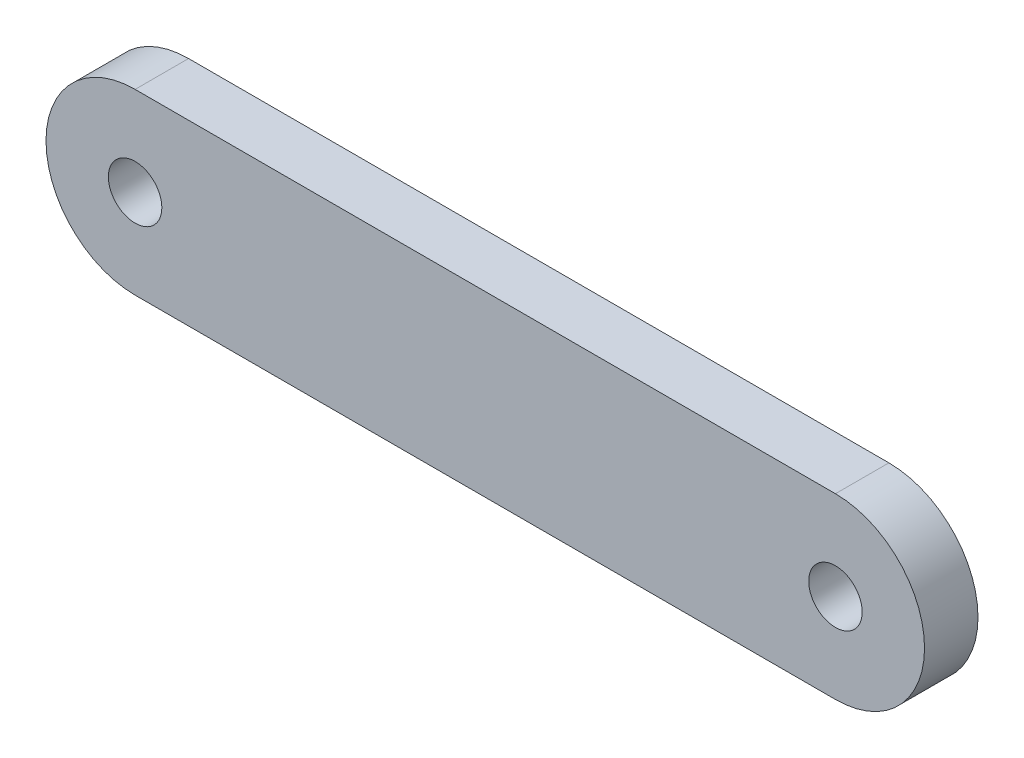
ISO-10303-21;
HEADER;
FILE_DESCRIPTION(('STEP AP214'),'2;1');
FILE_NAME('part.step','',(''),(''),'','','');
FILE_SCHEMA(('AUTOMOTIVE_DESIGN { 1 0 10303 214 1 1 1 1 }'));
ENDSEC;
DATA;
#1=APPLICATION_CONTEXT('core data for automotive mechanical design processes');
#2=APPLICATION_PROTOCOL_DEFINITION('international standard','automotive_design',2000,#1);
#3=PRODUCT_CONTEXT('',#1,'mechanical');
#4=PRODUCT('Part','Part','',(#3));
#5=PRODUCT_RELATED_PRODUCT_CATEGORY('part','',(#4));
#6=PRODUCT_DEFINITION_FORMATION('','',#4);
#7=PRODUCT_DEFINITION_CONTEXT('part definition',#1,'design');
#8=PRODUCT_DEFINITION('design','',#6,#7);
#9=PRODUCT_DEFINITION_SHAPE('','',#8);
#10=(LENGTH_UNIT() NAMED_UNIT(*) SI_UNIT(.MILLI.,.METRE.));
#11=(NAMED_UNIT(*) PLANE_ANGLE_UNIT() SI_UNIT($,.RADIAN.));
#12=(NAMED_UNIT(*) SI_UNIT($,.STERADIAN.) SOLID_ANGLE_UNIT());
#13=UNCERTAINTY_MEASURE_WITH_UNIT(LENGTH_MEASURE(1.E-05),#10,'distance_accuracy_value','');
#14=(GEOMETRIC_REPRESENTATION_CONTEXT(3) GLOBAL_UNCERTAINTY_ASSIGNED_CONTEXT((#13)) GLOBAL_UNIT_ASSIGNED_CONTEXT((#10,
#11,#12)) REPRESENTATION_CONTEXT('',''));
#15=CARTESIAN_POINT('',(0.,0.,0.));
#16=DIRECTION('',(0.,0.,1.));
#17=DIRECTION('',(1.,0.,0.));
#18=AXIS2_PLACEMENT_3D('',#15,#16,#17);
#19=CARTESIAN_POINT('',(0.,0.,3.));
#20=DIRECTION('',(0.,0.,1.));
#21=DIRECTION('',(1.,0.,0.));
#22=AXIS2_PLACEMENT_3D('',#19,#20,#21);
#23=PLANE('',#22);
#24=CARTESIAN_POINT('',(0.,0.,3.));
#25=DIRECTION('',(0.,0.,1.));
#26=DIRECTION('',(1.,0.,0.));
#27=AXIS2_PLACEMENT_3D('',#24,#25,#26);
#28=CIRCLE('',#27,1.5);
#29=CARTESIAN_POINT('',(1.5,0.,3.));
#30=VERTEX_POINT('',#29);
#31=EDGE_CURVE('E104',#30,#30,#28,.T.);
#32=ORIENTED_EDGE('',*,*,#31,.F.);
#33=EDGE_LOOP('',(#32));
#34=FACE_BOUND('',#33,.T.);
#35=CARTESIAN_POINT('',(0.,0.,3.));
#36=DIRECTION('',(0.,0.,1.));
#37=DIRECTION('',(1.,0.,0.));
#38=AXIS2_PLACEMENT_3D('',#35,#36,#37);
#39=CIRCLE('',#38,5.);
#40=CARTESIAN_POINT('',(0.,5.,3.));
#41=VERTEX_POINT('',#40);
#42=CARTESIAN_POINT('',(0.,-5.,3.));
#43=VERTEX_POINT('',#42);
#44=EDGE_CURVE('E89',#41,#43,#39,.T.);
#45=ORIENTED_EDGE('',*,*,#44,.T.);
#46=DIRECTION('',(1.,0.,0.));
#47=VECTOR('',#46,1.);
#48=CARTESIAN_POINT('',(0.,-5.,3.));
#49=LINE('',#48,#47);
#50=CARTESIAN_POINT('',(39.3,-5.,3.));
#51=VERTEX_POINT('',#50);
#52=EDGE_CURVE('E84',#43,#51,#49,.T.);
#53=ORIENTED_EDGE('',*,*,#52,.T.);
#54=CARTESIAN_POINT('',(39.3,0.,3.));
#55=DIRECTION('',(0.,0.,1.));
#56=DIRECTION('',(1.,0.,0.));
#57=AXIS2_PLACEMENT_3D('',#54,#55,#56);
#58=CIRCLE('',#57,5.);
#59=CARTESIAN_POINT('',(39.3,5.,3.));
#60=VERTEX_POINT('',#59);
#61=EDGE_CURVE('E87',#51,#60,#58,.T.);
#62=ORIENTED_EDGE('',*,*,#61,.T.);
#63=DIRECTION('',(-1.,0.,0.));
#64=VECTOR('',#63,1.);
#65=CARTESIAN_POINT('',(0.,5.,3.));
#66=LINE('',#65,#64);
#67=EDGE_CURVE('E54',#60,#41,#66,.T.);
#68=ORIENTED_EDGE('',*,*,#67,.T.);
#69=EDGE_LOOP('',(#45,#53,#62,#68));
#70=FACE_BOUND('',#69,.T.);
#71=CARTESIAN_POINT('',(39.3,0.,3.));
#72=DIRECTION('',(0.,0.,1.));
#73=DIRECTION('',(1.,0.,0.));
#74=AXIS2_PLACEMENT_3D('',#71,#72,#73);
#75=CIRCLE('',#74,1.5);
#76=CARTESIAN_POINT('',(40.8,0.,3.));
#77=VERTEX_POINT('',#76);
#78=EDGE_CURVE('E119',#77,#77,#75,.T.);
#79=ORIENTED_EDGE('',*,*,#78,.F.);
#80=EDGE_LOOP('',(#79));
#81=FACE_BOUND('',#80,.T.);
#82=ADVANCED_FACE('F37',(#34,#70,#81),#23,.T.);
#83=CARTESIAN_POINT('',(0.,0.,0.));
#84=DIRECTION('',(0.,0.,1.));
#85=DIRECTION('',(1.,0.,0.));
#86=AXIS2_PLACEMENT_3D('',#83,#84,#85);
#87=PLANE('',#86);
#88=CARTESIAN_POINT('',(0.,0.,0.));
#89=DIRECTION('',(0.,0.,1.));
#90=DIRECTION('',(1.,0.,0.));
#91=AXIS2_PLACEMENT_3D('',#88,#89,#90);
#92=CIRCLE('',#91,5.);
#93=CARTESIAN_POINT('',(0.,5.,0.));
#94=VERTEX_POINT('',#93);
#95=CARTESIAN_POINT('',(0.,-5.,0.));
#96=VERTEX_POINT('',#95);
#97=EDGE_CURVE('E101',#94,#96,#92,.T.);
#98=ORIENTED_EDGE('',*,*,#97,.F.);
#99=DIRECTION('',(-1.,0.,0.));
#100=VECTOR('',#99,1.);
#101=CARTESIAN_POINT('',(0.,5.,0.));
#102=LINE('',#101,#100);
#103=CARTESIAN_POINT('',(39.3,5.,0.));
#104=VERTEX_POINT('',#103);
#105=EDGE_CURVE('E77',#104,#94,#102,.T.);
#106=ORIENTED_EDGE('',*,*,#105,.F.);
#107=CARTESIAN_POINT('',(39.3,0.,0.));
#108=DIRECTION('',(0.,0.,1.));
#109=DIRECTION('',(1.,0.,0.));
#110=AXIS2_PLACEMENT_3D('',#107,#108,#109);
#111=CIRCLE('',#110,5.);
#112=CARTESIAN_POINT('',(39.3,-5.,0.));
#113=VERTEX_POINT('',#112);
#114=EDGE_CURVE('E71',#113,#104,#111,.T.);
#115=ORIENTED_EDGE('',*,*,#114,.F.);
#116=DIRECTION('',(1.,0.,0.));
#117=VECTOR('',#116,1.);
#118=CARTESIAN_POINT('',(0.,-5.,0.));
#119=LINE('',#118,#117);
#120=EDGE_CURVE('E93',#96,#113,#119,.T.);
#121=ORIENTED_EDGE('',*,*,#120,.F.);
#122=EDGE_LOOP('',(#98,#106,#115,#121));
#123=FACE_BOUND('',#122,.T.);
#124=CARTESIAN_POINT('',(0.,0.,0.));
#125=DIRECTION('',(0.,0.,1.));
#126=DIRECTION('',(1.,0.,0.));
#127=AXIS2_PLACEMENT_3D('',#124,#125,#126);
#128=CIRCLE('',#127,1.5);
#129=CARTESIAN_POINT('',(1.5,0.,0.));
#130=VERTEX_POINT('',#129);
#131=EDGE_CURVE('E116',#130,#130,#128,.T.);
#132=ORIENTED_EDGE('',*,*,#131,.T.);
#133=EDGE_LOOP('',(#132));
#134=FACE_BOUND('',#133,.T.);
#135=CARTESIAN_POINT('',(39.3,0.,0.));
#136=DIRECTION('',(0.,0.,1.));
#137=DIRECTION('',(1.,0.,0.));
#138=AXIS2_PLACEMENT_3D('',#135,#136,#137);
#139=CIRCLE('',#138,1.5);
#140=CARTESIAN_POINT('',(40.8,0.,0.));
#141=VERTEX_POINT('',#140);
#142=EDGE_CURVE('E122',#141,#141,#139,.T.);
#143=ORIENTED_EDGE('',*,*,#142,.T.);
#144=EDGE_LOOP('',(#143));
#145=FACE_BOUND('',#144,.T.);
#146=ADVANCED_FACE('F112',(#123,#134,#145),#87,.F.);
#147=CARTESIAN_POINT('',(0.,0.,3.));
#148=DIRECTION('',(0.,0.,-1.));
#149=DIRECTION('',(-1.,0.,0.));
#150=AXIS2_PLACEMENT_3D('',#147,#148,#149);
#151=CYLINDRICAL_SURFACE('',#150,5.);
#152=ORIENTED_EDGE('',*,*,#97,.T.);
#153=DIRECTION('',(0.,0.,-1.));
#154=VECTOR('',#153,1.);
#155=CARTESIAN_POINT('',(0.,-5.,3.));
#156=LINE('',#155,#154);
#157=EDGE_CURVE('E11',#43,#96,#156,.T.);
#158=ORIENTED_EDGE('',*,*,#157,.F.);
#159=ORIENTED_EDGE('',*,*,#44,.F.);
#160=DIRECTION('',(0.,0.,-1.));
#161=VECTOR('',#160,1.);
#162=CARTESIAN_POINT('',(0.,5.,3.));
#163=LINE('',#162,#161);
#164=EDGE_CURVE('E97',#41,#94,#163,.T.);
#165=ORIENTED_EDGE('',*,*,#164,.T.);
#166=EDGE_LOOP('',(#152,#158,#159,#165));
#167=FACE_BOUND('',#166,.T.);
#168=ADVANCED_FACE('F39',(#167),#151,.T.);
#169=CARTESIAN_POINT('',(0.,-5.,3.));
#170=DIRECTION('',(0.,1.,0.));
#171=DIRECTION('',(0.,0.,1.));
#172=AXIS2_PLACEMENT_3D('',#169,#170,#171);
#173=PLANE('',#172);
#174=ORIENTED_EDGE('',*,*,#120,.T.);
#175=DIRECTION('',(0.,0.,-1.));
#176=VECTOR('',#175,1.);
#177=CARTESIAN_POINT('',(39.3,-5.,3.));
#178=LINE('',#177,#176);
#179=EDGE_CURVE('E46',#51,#113,#178,.T.);
#180=ORIENTED_EDGE('',*,*,#179,.F.);
#181=ORIENTED_EDGE('',*,*,#52,.F.);
#182=ORIENTED_EDGE('',*,*,#157,.T.);
#183=EDGE_LOOP('',(#174,#180,#181,#182));
#184=FACE_BOUND('',#183,.T.);
#185=ADVANCED_FACE('F92',(#184),#173,.F.);
#186=CARTESIAN_POINT('',(39.3,0.,3.));
#187=DIRECTION('',(0.,0.,-1.));
#188=DIRECTION('',(-1.,0.,0.));
#189=AXIS2_PLACEMENT_3D('',#186,#187,#188);
#190=CYLINDRICAL_SURFACE('',#189,5.);
#191=ORIENTED_EDGE('',*,*,#114,.T.);
#192=DIRECTION('',(0.,0.,-1.));
#193=VECTOR('',#192,1.);
#194=CARTESIAN_POINT('',(39.3,5.,3.));
#195=LINE('',#194,#193);
#196=EDGE_CURVE('E94',#60,#104,#195,.T.);
#197=ORIENTED_EDGE('',*,*,#196,.F.);
#198=ORIENTED_EDGE('',*,*,#61,.F.);
#199=ORIENTED_EDGE('',*,*,#179,.T.);
#200=EDGE_LOOP('',(#191,#197,#198,#199));
#201=FACE_BOUND('',#200,.T.);
#202=ADVANCED_FACE('F95',(#201),#190,.T.);
#203=CARTESIAN_POINT('',(0.,5.,3.));
#204=DIRECTION('',(0.,-1.,0.));
#205=DIRECTION('',(0.,0.,-1.));
#206=AXIS2_PLACEMENT_3D('',#203,#204,#205);
#207=PLANE('',#206);
#208=ORIENTED_EDGE('',*,*,#105,.T.);
#209=ORIENTED_EDGE('',*,*,#164,.F.);
#210=ORIENTED_EDGE('',*,*,#67,.F.);
#211=ORIENTED_EDGE('',*,*,#196,.T.);
#212=EDGE_LOOP('',(#208,#209,#210,#211));
#213=FACE_BOUND('',#212,.T.);
#214=ADVANCED_FACE('F109',(#213),#207,.F.);
#215=CARTESIAN_POINT('',(0.,0.,3.));
#216=DIRECTION('',(0.,0.,-1.));
#217=DIRECTION('',(-1.,0.,0.));
#218=AXIS2_PLACEMENT_3D('',#215,#216,#217);
#219=CYLINDRICAL_SURFACE('',#218,1.5);
#220=ORIENTED_EDGE('',*,*,#31,.T.);
#221=EDGE_LOOP('',(#220));
#222=FACE_BOUND('',#221,.T.);
#223=ORIENTED_EDGE('',*,*,#131,.F.);
#224=EDGE_LOOP('',(#223));
#225=FACE_BOUND('',#224,.T.);
#226=ADVANCED_FACE('F139',(#222,#225),#219,.F.);
#227=CARTESIAN_POINT('',(39.3,0.,3.));
#228=DIRECTION('',(0.,0.,-1.));
#229=DIRECTION('',(-1.,0.,0.));
#230=AXIS2_PLACEMENT_3D('',#227,#228,#229);
#231=CYLINDRICAL_SURFACE('',#230,1.5);
#232=ORIENTED_EDGE('',*,*,#78,.T.);
#233=EDGE_LOOP('',(#232));
#234=FACE_BOUND('',#233,.T.);
#235=ORIENTED_EDGE('',*,*,#142,.F.);
#236=EDGE_LOOP('',(#235));
#237=FACE_BOUND('',#236,.T.);
#238=ADVANCED_FACE('F128',(#234,#237),#231,.F.);
#239=CLOSED_SHELL('',(#82,#146,#168,#185,#202,#214,#226,#238));
#240=MANIFOLD_SOLID_BREP('B2',#239);
#241=ADVANCED_BREP_SHAPE_REPRESENTATION('',(#18,#240),#14);
#242=SHAPE_DEFINITION_REPRESENTATION(#9,#241);
ENDSEC;
END-ISO-10303-21;
